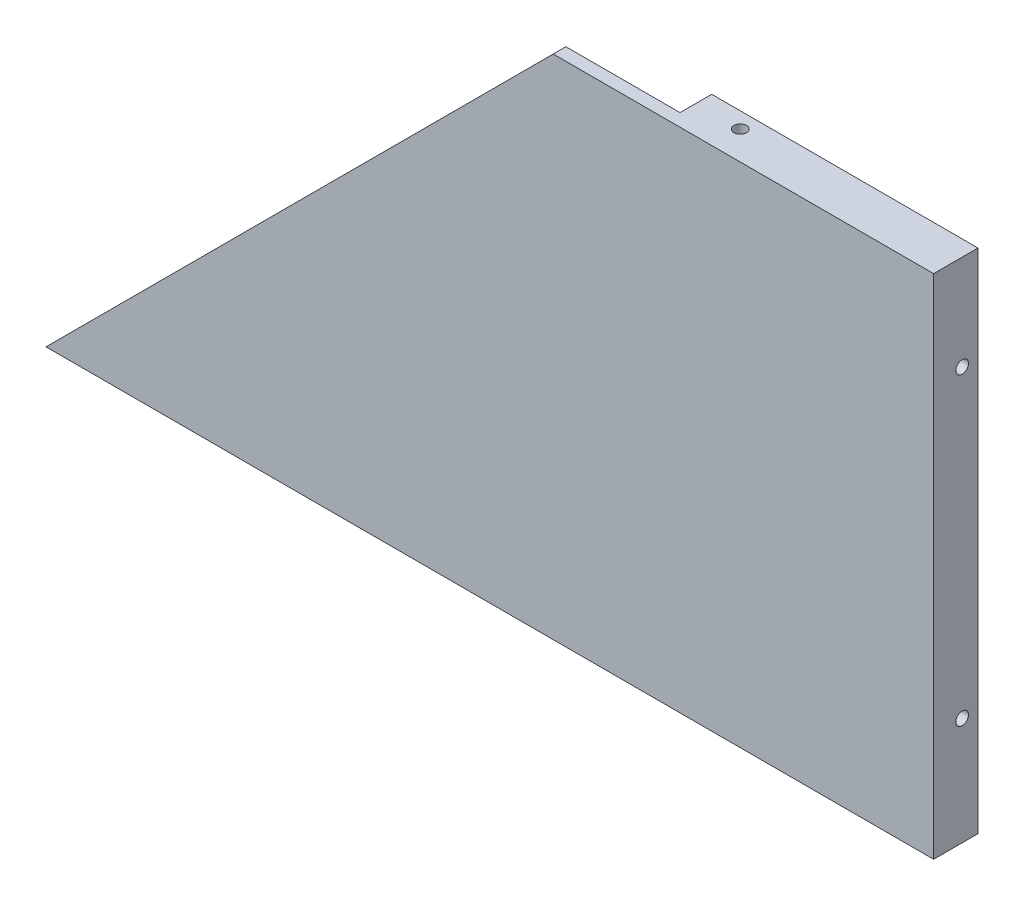
ISO-10303-21;
HEADER;
FILE_DESCRIPTION(('STEP AP214'),'2;1');
FILE_NAME('part.step','',(''),(''),'','','');
FILE_SCHEMA(('AUTOMOTIVE_DESIGN { 1 0 10303 214 1 1 1 1 }'));
ENDSEC;
DATA;
#1=APPLICATION_CONTEXT('core data for automotive mechanical design processes');
#2=APPLICATION_PROTOCOL_DEFINITION('international standard','automotive_design',2000,#1);
#3=PRODUCT_CONTEXT('',#1,'mechanical');
#4=PRODUCT('Part','Part','',(#3));
#5=PRODUCT_RELATED_PRODUCT_CATEGORY('part','',(#4));
#6=PRODUCT_DEFINITION_FORMATION('','',#4);
#7=PRODUCT_DEFINITION_CONTEXT('part definition',#1,'design');
#8=PRODUCT_DEFINITION('design','',#6,#7);
#9=PRODUCT_DEFINITION_SHAPE('','',#8);
#10=(LENGTH_UNIT() NAMED_UNIT(*) SI_UNIT(.MILLI.,.METRE.));
#11=(NAMED_UNIT(*) PLANE_ANGLE_UNIT() SI_UNIT($,.RADIAN.));
#12=(NAMED_UNIT(*) SI_UNIT($,.STERADIAN.) SOLID_ANGLE_UNIT());
#13=UNCERTAINTY_MEASURE_WITH_UNIT(LENGTH_MEASURE(1.E-05),#10,'distance_accuracy_value','');
#14=(GEOMETRIC_REPRESENTATION_CONTEXT(3) GLOBAL_UNCERTAINTY_ASSIGNED_CONTEXT((#13)) GLOBAL_UNIT_ASSIGNED_CONTEXT((#10,
#11,#12)) REPRESENTATION_CONTEXT('',''));
#15=CARTESIAN_POINT('',(0.,0.,0.));
#16=DIRECTION('',(0.,0.,1.));
#17=DIRECTION('',(1.,0.,0.));
#18=AXIS2_PLACEMENT_3D('',#15,#16,#17);
#19=CARTESIAN_POINT('',(0.,0.,0.));
#20=DIRECTION('',(0.,0.,-1.));
#21=DIRECTION('',(-1.,0.,0.));
#22=AXIS2_PLACEMENT_3D('',#19,#20,#21);
#23=PLANE('',#22);
#24=DIRECTION('',(-0.707106781186544,0.707106781186551,0.));
#25=VECTOR('',#24,1.);
#26=CARTESIAN_POINT('',(-248.887301627792,25.4558441227155,0.));
#27=LINE('',#26,#25);
#28=CARTESIAN_POINT('',(-248.887301627792,25.4558441227155,0.));
#29=VERTEX_POINT('',#28);
#30=CARTESIAN_POINT('',(-251.715728752538,28.2842712474618,0.));
#31=VERTEX_POINT('',#30);
#32=EDGE_CURVE('E161',#29,#31,#27,.T.);
#33=ORIENTED_EDGE('',*,*,#32,.F.);
#34=DIRECTION('',(0.707106781186551,0.707106781186544,0.));
#35=VECTOR('',#34,1.);
#36=CARTESIAN_POINT('',(-131.313708498983,143.029437251523,0.));
#37=LINE('',#36,#35);
#38=CARTESIAN_POINT('',(-131.313708498983,143.029437251523,0.));
#39=VERTEX_POINT('',#38);
#40=EDGE_CURVE('E154',#29,#39,#37,.T.);
#41=ORIENTED_EDGE('',*,*,#40,.T.);
#42=DIRECTION('',(-0.707106781186544,0.707106781186551,0.));
#43=VECTOR('',#42,1.);
#44=CARTESIAN_POINT('',(-131.313708498983,143.029437251523,0.));
#45=LINE('',#44,#43);
#46=CARTESIAN_POINT('',(-134.142135623729,145.857864376269,0.));
#47=VERTEX_POINT('',#46);
#48=EDGE_CURVE('E137',#39,#47,#45,.T.);
#49=ORIENTED_EDGE('',*,*,#48,.T.);
#50=DIRECTION('',(-0.707106781186551,-0.707106781186544,0.));
#51=VECTOR('',#50,1.);
#52=CARTESIAN_POINT('',(-280.,0.,0.));
#53=LINE('',#52,#51);
#54=CARTESIAN_POINT('',(-119.999999999998,160.,0.));
#55=VERTEX_POINT('',#54);
#56=EDGE_CURVE('E278',#55,#47,#53,.T.);
#57=ORIENTED_EDGE('',*,*,#56,.F.);
#58=DIRECTION('',(-1.,0.,0.));
#59=VECTOR('',#58,1.);
#60=CARTESIAN_POINT('',(-119.999999999998,160.,0.));
#61=LINE('',#60,#59);
#62=CARTESIAN_POINT('',(-84.,160.,0.));
#63=VERTEX_POINT('',#62);
#64=EDGE_CURVE('E260',#63,#55,#61,.T.);
#65=ORIENTED_EDGE('',*,*,#64,.F.);
#66=DIRECTION('',(0.,1.,0.));
#67=VECTOR('',#66,1.);
#68=CARTESIAN_POINT('',(-84.,156.,0.));
#69=LINE('',#68,#67);
#70=CARTESIAN_POINT('',(-84.,156.,0.));
#71=VERTEX_POINT('',#70);
#72=EDGE_CURVE('E197',#71,#63,#69,.T.);
#73=ORIENTED_EDGE('',*,*,#72,.F.);
#74=DIRECTION('',(1.,0.,0.));
#75=VECTOR('',#74,1.);
#76=CARTESIAN_POINT('',(-84.,156.,0.));
#77=LINE('',#76,#75);
#78=CARTESIAN_POINT('',(-4.,156.,0.));
#79=VERTEX_POINT('',#78);
#80=EDGE_CURVE('E188',#71,#79,#77,.T.);
#81=ORIENTED_EDGE('',*,*,#80,.T.);
#82=DIRECTION('',(0.,-1.,0.));
#83=VECTOR('',#82,1.);
#84=CARTESIAN_POINT('',(-4.,160.,0.));
#85=LINE('',#84,#83);
#86=CARTESIAN_POINT('',(-4.,4.,0.));
#87=VERTEX_POINT('',#86);
#88=EDGE_CURVE('E214',#79,#87,#85,.T.);
#89=ORIENTED_EDGE('',*,*,#88,.T.);
#90=DIRECTION('',(-1.,0.,0.));
#91=VECTOR('',#90,1.);
#92=CARTESIAN_POINT('',(-260.,4.,0.));
#93=LINE('',#92,#91);
#94=CARTESIAN_POINT('',(-260.,4.,0.));
#95=VERTEX_POINT('',#94);
#96=EDGE_CURVE('E252',#87,#95,#93,.T.);
#97=ORIENTED_EDGE('',*,*,#96,.T.);
#98=DIRECTION('',(0.,-1.,0.));
#99=VECTOR('',#98,1.);
#100=CARTESIAN_POINT('',(-260.,4.,0.));
#101=LINE('',#100,#99);
#102=CARTESIAN_POINT('',(-260.,0.,0.));
#103=VERTEX_POINT('',#102);
#104=EDGE_CURVE('E258',#95,#103,#101,.T.);
#105=ORIENTED_EDGE('',*,*,#104,.T.);
#106=DIRECTION('',(1.,0.,0.));
#107=VECTOR('',#106,1.);
#108=CARTESIAN_POINT('',(0.,0.,0.));
#109=LINE('',#108,#107);
#110=CARTESIAN_POINT('',(-280.,0.,0.));
#111=VERTEX_POINT('',#110);
#112=EDGE_CURVE('E269',#111,#103,#109,.T.);
#113=ORIENTED_EDGE('',*,*,#112,.F.);
#114=EDGE_CURVE('E277',#31,#111,#53,.T.);
#115=ORIENTED_EDGE('',*,*,#114,.F.);
#116=EDGE_LOOP('',(#33,#41,#49,#57,#65,#73,#81,#89,#97,#105,#113,#115));
#117=FACE_BOUND('',#116,.T.);
#118=ADVANCED_FACE('F35',(#117),#23,.T.);
#119=CARTESIAN_POINT('',(0.,4.,0.));
#120=DIRECTION('',(0.,-1.,0.));
#121=DIRECTION('',(0.,0.,-1.));
#122=AXIS2_PLACEMENT_3D('',#119,#120,#121);
#123=PLANE('',#122);
#124=CARTESIAN_POINT('',(-210.,4.,-5.));
#125=DIRECTION('',(0.,-1.,0.));
#126=DIRECTION('',(0.,0.,-1.));
#127=AXIS2_PLACEMENT_3D('',#124,#125,#126);
#128=CIRCLE('',#127,2.);
#129=CARTESIAN_POINT('',(-210.,4.,-7.));
#130=VERTEX_POINT('',#129);
#131=EDGE_CURVE('E240',#130,#130,#128,.T.);
#132=ORIENTED_EDGE('',*,*,#131,.T.);
#133=EDGE_LOOP('',(#132));
#134=FACE_BOUND('',#133,.T.);
#135=CARTESIAN_POINT('',(-140.,4.,-5.));
#136=DIRECTION('',(0.,-1.,0.));
#137=DIRECTION('',(0.,0.,-1.));
#138=AXIS2_PLACEMENT_3D('',#135,#136,#137);
#139=CIRCLE('',#138,2.);
#140=CARTESIAN_POINT('',(-140.,4.,-7.));
#141=VERTEX_POINT('',#140);
#142=EDGE_CURVE('E234',#141,#141,#139,.T.);
#143=ORIENTED_EDGE('',*,*,#142,.T.);
#144=EDGE_LOOP('',(#143));
#145=FACE_BOUND('',#144,.T.);
#146=CARTESIAN_POINT('',(-70.,4.,-5.));
#147=DIRECTION('',(0.,-1.,0.));
#148=DIRECTION('',(0.,0.,-1.));
#149=AXIS2_PLACEMENT_3D('',#146,#147,#148);
#150=CIRCLE('',#149,2.);
#151=CARTESIAN_POINT('',(-70.,4.,-7.));
#152=VERTEX_POINT('',#151);
#153=EDGE_CURVE('E228',#152,#152,#150,.T.);
#154=ORIENTED_EDGE('',*,*,#153,.T.);
#155=EDGE_LOOP('',(#154));
#156=FACE_BOUND('',#155,.T.);
#157=DIRECTION('',(0.,0.,-1.));
#158=VECTOR('',#157,1.);
#159=CARTESIAN_POINT('',(-4.,4.,0.));
#160=LINE('',#159,#158);
#161=CARTESIAN_POINT('',(-4.,4.,-10.));
#162=VERTEX_POINT('',#161);
#163=EDGE_CURVE('E218',#87,#162,#160,.T.);
#164=ORIENTED_EDGE('',*,*,#163,.T.);
#165=DIRECTION('',(1.,0.,0.));
#166=VECTOR('',#165,1.);
#167=CARTESIAN_POINT('',(-260.,4.,-10.));
#168=LINE('',#167,#166);
#169=CARTESIAN_POINT('',(-260.,4.,-10.));
#170=VERTEX_POINT('',#169);
#171=EDGE_CURVE('E248',#170,#162,#168,.T.);
#172=ORIENTED_EDGE('',*,*,#171,.F.);
#173=DIRECTION('',(0.,0.,-1.));
#174=VECTOR('',#173,1.);
#175=CARTESIAN_POINT('',(-260.,4.,0.));
#176=LINE('',#175,#174);
#177=EDGE_CURVE('E245',#95,#170,#176,.T.);
#178=ORIENTED_EDGE('',*,*,#177,.F.);
#179=ORIENTED_EDGE('',*,*,#96,.F.);
#180=EDGE_LOOP('',(#164,#172,#178,#179));
#181=FACE_BOUND('',#180,.T.);
#182=ADVANCED_FACE('F312',(#134,#145,#156,#181),#123,.F.);
#183=CARTESIAN_POINT('',(0.,160.,4.));
#184=DIRECTION('',(-1.,0.,0.));
#185=DIRECTION('',(0.,-1.,0.));
#186=AXIS2_PLACEMENT_3D('',#183,#184,#185);
#187=PLANE('',#186);
#188=DIRECTION('',(0.,-1.,0.));
#189=VECTOR('',#188,1.);
#190=CARTESIAN_POINT('',(0.,4.,-10.));
#191=LINE('',#190,#189);
#192=CARTESIAN_POINT('',(0.,160.,-9.99999999999998));
#193=VERTEX_POINT('',#192);
#194=CARTESIAN_POINT('',(0.,0.,-10.));
#195=VERTEX_POINT('',#194);
#196=EDGE_CURVE('E261',#193,#195,#191,.T.);
#197=ORIENTED_EDGE('',*,*,#196,.F.);
#198=DIRECTION('',(0.,0.,-1.));
#199=VECTOR('',#198,1.);
#200=CARTESIAN_POINT('',(0.,160.,4.));
#201=LINE('',#200,#199);
#202=CARTESIAN_POINT('',(0.,160.,4.));
#203=VERTEX_POINT('',#202);
#204=EDGE_CURVE('E11',#203,#193,#201,.T.);
#205=ORIENTED_EDGE('',*,*,#204,.F.);
#206=DIRECTION('',(0.,1.,0.));
#207=VECTOR('',#206,1.);
#208=CARTESIAN_POINT('',(0.,160.,4.));
#209=LINE('',#208,#207);
#210=CARTESIAN_POINT('',(0.,0.,4.));
#211=VERTEX_POINT('',#210);
#212=EDGE_CURVE('E265',#211,#203,#209,.T.);
#213=ORIENTED_EDGE('',*,*,#212,.F.);
#214=DIRECTION('',(0.,0.,-1.));
#215=VECTOR('',#214,1.);
#216=CARTESIAN_POINT('',(0.,0.,4.));
#217=LINE('',#216,#215);
#218=EDGE_CURVE('E275',#211,#195,#217,.T.);
#219=ORIENTED_EDGE('',*,*,#218,.T.);
#220=EDGE_LOOP('',(#197,#205,#213,#219));
#221=FACE_BOUND('',#220,.T.);
#222=CARTESIAN_POINT('',(0.,130.,-4.99999999999999));
#223=DIRECTION('',(1.,0.,0.));
#224=DIRECTION('',(0.,1.,0.));
#225=AXIS2_PLACEMENT_3D('',#222,#223,#224);
#226=CIRCLE('',#225,2.);
#227=CARTESIAN_POINT('',(0.,132.,-4.99999999999999));
#228=VERTEX_POINT('',#227);
#229=EDGE_CURVE('E203',#228,#228,#226,.T.);
#230=ORIENTED_EDGE('',*,*,#229,.F.);
#231=EDGE_LOOP('',(#230));
#232=FACE_BOUND('',#231,.T.);
#233=CARTESIAN_POINT('',(0.,34.,-5.));
#234=DIRECTION('',(1.,0.,0.));
#235=DIRECTION('',(0.,1.,0.));
#236=AXIS2_PLACEMENT_3D('',#233,#234,#235);
#237=CIRCLE('',#236,2.);
#238=CARTESIAN_POINT('',(0.,36.,-5.));
#239=VERTEX_POINT('',#238);
#240=EDGE_CURVE('E208',#239,#239,#237,.T.);
#241=ORIENTED_EDGE('',*,*,#240,.F.);
#242=EDGE_LOOP('',(#241));
#243=FACE_BOUND('',#242,.T.);
#244=ADVANCED_FACE('F37',(#221,#232,#243),#187,.F.);
#245=CARTESIAN_POINT('',(-119.999999999998,160.,4.));
#246=DIRECTION('',(0.,-1.,0.));
#247=DIRECTION('',(0.,0.,-1.));
#248=AXIS2_PLACEMENT_3D('',#245,#246,#247);
#249=PLANE('',#248);
#250=DIRECTION('',(0.,0.,1.));
#251=VECTOR('',#250,1.);
#252=CARTESIAN_POINT('',(-84.,160.,0.));
#253=LINE('',#252,#251);
#254=CARTESIAN_POINT('',(-84.,160.,-10.));
#255=VERTEX_POINT('',#254);
#256=EDGE_CURVE('E182',#255,#63,#253,.T.);
#257=ORIENTED_EDGE('',*,*,#256,.T.);
#258=ORIENTED_EDGE('',*,*,#64,.T.);
#259=DIRECTION('',(0.,0.,-1.));
#260=VECTOR('',#259,1.);
#261=CARTESIAN_POINT('',(-119.999999999998,160.,4.));
#262=LINE('',#261,#260);
#263=CARTESIAN_POINT('',(-119.999999999998,160.,4.));
#264=VERTEX_POINT('',#263);
#265=EDGE_CURVE('E43',#264,#55,#262,.T.);
#266=ORIENTED_EDGE('',*,*,#265,.F.);
#267=DIRECTION('',(-1.,0.,0.));
#268=VECTOR('',#267,1.);
#269=CARTESIAN_POINT('',(-119.999999999998,160.,4.));
#270=LINE('',#269,#268);
#271=EDGE_CURVE('E268',#203,#264,#270,.T.);
#272=ORIENTED_EDGE('',*,*,#271,.F.);
#273=ORIENTED_EDGE('',*,*,#204,.T.);
#274=DIRECTION('',(1.,0.,0.));
#275=VECTOR('',#274,1.);
#276=CARTESIAN_POINT('',(-4.,160.,-9.99999999999998));
#277=LINE('',#276,#275);
#278=EDGE_CURVE('E224',#255,#193,#277,.T.);
#279=ORIENTED_EDGE('',*,*,#278,.F.);
#280=EDGE_LOOP('',(#257,#258,#266,#272,#273,#279));
#281=FACE_BOUND('',#280,.T.);
#282=CARTESIAN_POINT('',(-70.,160.,-5.));
#283=DIRECTION('',(0.,1.,0.));
#284=DIRECTION('',(0.,0.,1.));
#285=AXIS2_PLACEMENT_3D('',#282,#283,#284);
#286=CIRCLE('',#285,2.);
#287=CARTESIAN_POINT('',(-70.,160.,-3.));
#288=VERTEX_POINT('',#287);
#289=EDGE_CURVE('E175',#288,#288,#286,.T.);
#290=ORIENTED_EDGE('',*,*,#289,.F.);
#291=EDGE_LOOP('',(#290));
#292=FACE_BOUND('',#291,.T.);
#293=ADVANCED_FACE('F294',(#281,#292),#249,.F.);
#294=CARTESIAN_POINT('',(-280.,0.,4.));
#295=DIRECTION('',(0.707106781186544,-0.707106781186551,0.));
#296=DIRECTION('',(0.707106781186551,0.707106781186544,0.));
#297=AXIS2_PLACEMENT_3D('',#294,#295,#296);
#298=PLANE('',#297);
#299=ORIENTED_EDGE('',*,*,#56,.T.);
#300=DIRECTION('',(0.,0.,-1.));
#301=VECTOR('',#300,1.);
#302=CARTESIAN_POINT('',(-134.142135623729,145.857864376269,0.));
#303=LINE('',#302,#301);
#304=CARTESIAN_POINT('',(-134.142135623729,145.857864376269,-10.));
#305=VERTEX_POINT('',#304);
#306=EDGE_CURVE('E142',#47,#305,#303,.T.);
#307=ORIENTED_EDGE('',*,*,#306,.T.);
#308=DIRECTION('',(-0.707106781186551,-0.707106781186544,0.));
#309=VECTOR('',#308,1.);
#310=CARTESIAN_POINT('',(-134.142135623729,145.857864376269,-10.));
#311=LINE('',#310,#309);
#312=CARTESIAN_POINT('',(-251.715728752538,28.2842712474617,-10.));
#313=VERTEX_POINT('',#312);
#314=EDGE_CURVE('E163',#305,#313,#311,.T.);
#315=ORIENTED_EDGE('',*,*,#314,.T.);
#316=DIRECTION('',(0.,0.,1.));
#317=VECTOR('',#316,1.);
#318=CARTESIAN_POINT('',(-251.715728752538,28.2842712474617,0.));
#319=LINE('',#318,#317);
#320=EDGE_CURVE('E50',#313,#31,#319,.T.);
#321=ORIENTED_EDGE('',*,*,#320,.T.);
#322=ORIENTED_EDGE('',*,*,#114,.T.);
#323=DIRECTION('',(0.,0.,-1.));
#324=VECTOR('',#323,1.);
#325=CARTESIAN_POINT('',(-280.,0.,4.));
#326=LINE('',#325,#324);
#327=CARTESIAN_POINT('',(-280.,0.,4.));
#328=VERTEX_POINT('',#327);
#329=EDGE_CURVE('E283',#328,#111,#326,.T.);
#330=ORIENTED_EDGE('',*,*,#329,.F.);
#331=DIRECTION('',(-0.707106781186551,-0.707106781186544,0.));
#332=VECTOR('',#331,1.);
#333=CARTESIAN_POINT('',(-280.,0.,4.));
#334=LINE('',#333,#332);
#335=EDGE_CURVE('E271',#264,#328,#334,.T.);
#336=ORIENTED_EDGE('',*,*,#335,.F.);
#337=ORIENTED_EDGE('',*,*,#265,.T.);
#338=EDGE_LOOP('',(#299,#307,#315,#321,#322,#330,#336,#337));
#339=FACE_BOUND('',#338,.T.);
#340=CARTESIAN_POINT('',(-237.573593128807,42.4264068711926,-5.));
#341=DIRECTION('',(-0.707106781186544,0.707106781186551,0.));
#342=DIRECTION('',(-0.707106781186551,-0.707106781186544,0.));
#343=AXIS2_PLACEMENT_3D('',#340,#341,#342);
#344=CIRCLE('',#343,2.);
#345=CARTESIAN_POINT('',(-238.98780669118,41.0121933088195,-5.));
#346=VERTEX_POINT('',#345);
#347=EDGE_CURVE('E566',#346,#346,#344,.T.);
#348=ORIENTED_EDGE('',*,*,#347,.F.);
#349=EDGE_LOOP('',(#348));
#350=FACE_BOUND('',#349,.T.);
#351=CARTESIAN_POINT('',(-148.28427124746,131.715728752538,-5.));
#352=DIRECTION('',(-0.707106781186544,0.707106781186551,0.));
#353=DIRECTION('',(-0.707106781186551,-0.707106781186544,0.));
#354=AXIS2_PLACEMENT_3D('',#351,#352,#353);
#355=CIRCLE('',#354,2.);
#356=CARTESIAN_POINT('',(-149.698484809833,130.301515190165,-5.));
#357=VERTEX_POINT('',#356);
#358=EDGE_CURVE('E166',#357,#357,#355,.T.);
#359=ORIENTED_EDGE('',*,*,#358,.F.);
#360=EDGE_LOOP('',(#359));
#361=FACE_BOUND('',#360,.T.);
#362=ADVANCED_FACE('F288',(#339,#350,#361),#298,.F.);
#363=CARTESIAN_POINT('',(0.,0.,4.));
#364=DIRECTION('',(0.,1.,0.));
#365=DIRECTION('',(-1.,0.,0.));
#366=AXIS2_PLACEMENT_3D('',#363,#364,#365);
#367=PLANE('',#366);
#368=ORIENTED_EDGE('',*,*,#112,.T.);
#369=DIRECTION('',(0.,0.,-1.));
#370=VECTOR('',#369,1.);
#371=CARTESIAN_POINT('',(-260.,0.,0.));
#372=LINE('',#371,#370);
#373=CARTESIAN_POINT('',(-260.,0.,-10.));
#374=VERTEX_POINT('',#373);
#375=EDGE_CURVE('E58',#103,#374,#372,.T.);
#376=ORIENTED_EDGE('',*,*,#375,.T.);
#377=DIRECTION('',(1.,0.,0.));
#378=VECTOR('',#377,1.);
#379=CARTESIAN_POINT('',(-260.,0.,-10.));
#380=LINE('',#379,#378);
#381=EDGE_CURVE('E249',#374,#195,#380,.T.);
#382=ORIENTED_EDGE('',*,*,#381,.T.);
#383=ORIENTED_EDGE('',*,*,#218,.F.);
#384=DIRECTION('',(1.,0.,0.));
#385=VECTOR('',#384,1.);
#386=CARTESIAN_POINT('',(0.,0.,4.));
#387=LINE('',#386,#385);
#388=EDGE_CURVE('E273',#328,#211,#387,.T.);
#389=ORIENTED_EDGE('',*,*,#388,.F.);
#390=ORIENTED_EDGE('',*,*,#329,.T.);
#391=EDGE_LOOP('',(#368,#376,#382,#383,#389,#390));
#392=FACE_BOUND('',#391,.T.);
#393=CARTESIAN_POINT('',(-70.,0.,-5.));
#394=DIRECTION('',(0.,-1.,0.));
#395=DIRECTION('',(0.,0.,-1.));
#396=AXIS2_PLACEMENT_3D('',#393,#394,#395);
#397=CIRCLE('',#396,2.);
#398=CARTESIAN_POINT('',(-70.,0.,-7.));
#399=VERTEX_POINT('',#398);
#400=EDGE_CURVE('E227',#399,#399,#397,.T.);
#401=ORIENTED_EDGE('',*,*,#400,.F.);
#402=EDGE_LOOP('',(#401));
#403=FACE_BOUND('',#402,.T.);
#404=CARTESIAN_POINT('',(-140.,0.,-5.));
#405=DIRECTION('',(0.,-1.,0.));
#406=DIRECTION('',(0.,0.,-1.));
#407=AXIS2_PLACEMENT_3D('',#404,#405,#406);
#408=CIRCLE('',#407,2.);
#409=CARTESIAN_POINT('',(-140.,0.,-7.));
#410=VERTEX_POINT('',#409);
#411=EDGE_CURVE('E231',#410,#410,#408,.T.);
#412=ORIENTED_EDGE('',*,*,#411,.F.);
#413=EDGE_LOOP('',(#412));
#414=FACE_BOUND('',#413,.T.);
#415=CARTESIAN_POINT('',(-210.,0.,-5.));
#416=DIRECTION('',(0.,-1.,0.));
#417=DIRECTION('',(0.,0.,-1.));
#418=AXIS2_PLACEMENT_3D('',#415,#416,#417);
#419=CIRCLE('',#418,2.);
#420=CARTESIAN_POINT('',(-210.,0.,-7.));
#421=VERTEX_POINT('',#420);
#422=EDGE_CURVE('E237',#421,#421,#419,.T.);
#423=ORIENTED_EDGE('',*,*,#422,.F.);
#424=EDGE_LOOP('',(#423));
#425=FACE_BOUND('',#424,.T.);
#426=ADVANCED_FACE('F319',(#392,#403,#414,#425),#367,.F.);
#427=CARTESIAN_POINT('',(0.,0.,4.));
#428=DIRECTION('',(0.,0.,-1.));
#429=DIRECTION('',(-1.,0.,0.));
#430=AXIS2_PLACEMENT_3D('',#427,#428,#429);
#431=PLANE('',#430);
#432=ORIENTED_EDGE('',*,*,#212,.T.);
#433=ORIENTED_EDGE('',*,*,#271,.T.);
#434=ORIENTED_EDGE('',*,*,#335,.T.);
#435=ORIENTED_EDGE('',*,*,#388,.T.);
#436=EDGE_LOOP('',(#432,#433,#434,#435));
#437=FACE_BOUND('',#436,.T.);
#438=ADVANCED_FACE('F324',(#437),#431,.F.);
#439=CARTESIAN_POINT('',(-260.,4.,0.));
#440=DIRECTION('',(-1.,0.,0.));
#441=DIRECTION('',(0.,0.,1.));
#442=AXIS2_PLACEMENT_3D('',#439,#440,#441);
#443=PLANE('',#442);
#444=ORIENTED_EDGE('',*,*,#375,.F.);
#445=ORIENTED_EDGE('',*,*,#104,.F.);
#446=ORIENTED_EDGE('',*,*,#177,.T.);
#447=DIRECTION('',(0.,-1.,0.));
#448=VECTOR('',#447,1.);
#449=CARTESIAN_POINT('',(-260.,4.,-10.));
#450=LINE('',#449,#448);
#451=EDGE_CURVE('E254',#170,#374,#450,.T.);
#452=ORIENTED_EDGE('',*,*,#451,.T.);
#453=EDGE_LOOP('',(#444,#445,#446,#452));
#454=FACE_BOUND('',#453,.T.);
#455=ADVANCED_FACE('F315',(#454),#443,.T.);
#456=CARTESIAN_POINT('',(-260.,4.,-10.));
#457=DIRECTION('',(0.,0.,-1.));
#458=DIRECTION('',(-1.,0.,0.));
#459=AXIS2_PLACEMENT_3D('',#456,#457,#458);
#460=PLANE('',#459);
#461=ORIENTED_EDGE('',*,*,#381,.F.);
#462=ORIENTED_EDGE('',*,*,#451,.F.);
#463=ORIENTED_EDGE('',*,*,#171,.T.);
#464=DIRECTION('',(0.,1.,0.));
#465=VECTOR('',#464,1.);
#466=CARTESIAN_POINT('',(-4.,160.,-9.99999999999998));
#467=LINE('',#466,#465);
#468=CARTESIAN_POINT('',(-4.,156.,-10.));
#469=VERTEX_POINT('',#468);
#470=EDGE_CURVE('E221',#162,#469,#467,.T.);
#471=ORIENTED_EDGE('',*,*,#470,.T.);
#472=DIRECTION('',(-1.,0.,0.));
#473=VECTOR('',#472,1.);
#474=CARTESIAN_POINT('',(-84.,156.,-10.));
#475=LINE('',#474,#473);
#476=CARTESIAN_POINT('',(-84.,156.,-10.));
#477=VERTEX_POINT('',#476);
#478=EDGE_CURVE('E194',#469,#477,#475,.T.);
#479=ORIENTED_EDGE('',*,*,#478,.T.);
#480=DIRECTION('',(0.,1.,0.));
#481=VECTOR('',#480,1.);
#482=CARTESIAN_POINT('',(-84.,156.,-10.));
#483=LINE('',#482,#481);
#484=EDGE_CURVE('E200',#477,#255,#483,.T.);
#485=ORIENTED_EDGE('',*,*,#484,.T.);
#486=ORIENTED_EDGE('',*,*,#278,.T.);
#487=ORIENTED_EDGE('',*,*,#196,.T.);
#488=EDGE_LOOP('',(#461,#462,#463,#471,#479,#485,#486,#487));
#489=FACE_BOUND('',#488,.T.);
#490=ADVANCED_FACE('F304',(#489),#460,.T.);
#491=CARTESIAN_POINT('',(-210.,4.,-5.));
#492=DIRECTION('',(0.,-1.,0.));
#493=DIRECTION('',(0.,0.,-1.));
#494=AXIS2_PLACEMENT_3D('',#491,#492,#493);
#495=CYLINDRICAL_SURFACE('',#494,2.);
#496=ORIENTED_EDGE('',*,*,#131,.F.);
#497=EDGE_LOOP('',(#496));
#498=FACE_BOUND('',#497,.T.);
#499=ORIENTED_EDGE('',*,*,#422,.T.);
#500=EDGE_LOOP('',(#499));
#501=FACE_BOUND('',#500,.T.);
#502=ADVANCED_FACE('F393',(#498,#501),#495,.F.);
#503=CARTESIAN_POINT('',(-140.,4.,-5.));
#504=DIRECTION('',(0.,-1.,0.));
#505=DIRECTION('',(0.,0.,-1.));
#506=AXIS2_PLACEMENT_3D('',#503,#504,#505);
#507=CYLINDRICAL_SURFACE('',#506,2.);
#508=ORIENTED_EDGE('',*,*,#142,.F.);
#509=EDGE_LOOP('',(#508));
#510=FACE_BOUND('',#509,.T.);
#511=ORIENTED_EDGE('',*,*,#411,.T.);
#512=EDGE_LOOP('',(#511));
#513=FACE_BOUND('',#512,.T.);
#514=ADVANCED_FACE('F400',(#510,#513),#507,.F.);
#515=CARTESIAN_POINT('',(-70.,4.,-5.));
#516=DIRECTION('',(0.,-1.,0.));
#517=DIRECTION('',(0.,0.,-1.));
#518=AXIS2_PLACEMENT_3D('',#515,#516,#517);
#519=CYLINDRICAL_SURFACE('',#518,2.);
#520=ORIENTED_EDGE('',*,*,#153,.F.);
#521=EDGE_LOOP('',(#520));
#522=FACE_BOUND('',#521,.T.);
#523=ORIENTED_EDGE('',*,*,#400,.T.);
#524=EDGE_LOOP('',(#523));
#525=FACE_BOUND('',#524,.T.);
#526=ADVANCED_FACE('F344',(#522,#525),#519,.F.);
#527=CARTESIAN_POINT('',(-4.,0.,0.));
#528=DIRECTION('',(1.,0.,0.));
#529=DIRECTION('',(0.,1.,0.));
#530=AXIS2_PLACEMENT_3D('',#527,#528,#529);
#531=PLANE('',#530);
#532=CARTESIAN_POINT('',(-4.,130.,-4.99999999999999));
#533=DIRECTION('',(1.,0.,0.));
#534=DIRECTION('',(0.,1.,0.));
#535=AXIS2_PLACEMENT_3D('',#532,#533,#534);
#536=CIRCLE('',#535,2.);
#537=CARTESIAN_POINT('',(-4.,132.,-4.99999999999999));
#538=VERTEX_POINT('',#537);
#539=EDGE_CURVE('E205',#538,#538,#536,.T.);
#540=ORIENTED_EDGE('',*,*,#539,.T.);
#541=EDGE_LOOP('',(#540));
#542=FACE_BOUND('',#541,.T.);
#543=CARTESIAN_POINT('',(-4.,34.,-5.));
#544=DIRECTION('',(1.,0.,0.));
#545=DIRECTION('',(0.,1.,0.));
#546=AXIS2_PLACEMENT_3D('',#543,#544,#545);
#547=CIRCLE('',#546,2.);
#548=CARTESIAN_POINT('',(-4.,36.,-5.));
#549=VERTEX_POINT('',#548);
#550=EDGE_CURVE('E211',#549,#549,#547,.T.);
#551=ORIENTED_EDGE('',*,*,#550,.T.);
#552=EDGE_LOOP('',(#551));
#553=FACE_BOUND('',#552,.T.);
#554=ORIENTED_EDGE('',*,*,#88,.F.);
#555=DIRECTION('',(0.,0.,-1.));
#556=VECTOR('',#555,1.);
#557=CARTESIAN_POINT('',(-4.,156.,0.));
#558=LINE('',#557,#556);
#559=EDGE_CURVE('E191',#79,#469,#558,.T.);
#560=ORIENTED_EDGE('',*,*,#559,.T.);
#561=ORIENTED_EDGE('',*,*,#470,.F.);
#562=ORIENTED_EDGE('',*,*,#163,.F.);
#563=EDGE_LOOP('',(#554,#560,#561,#562));
#564=FACE_BOUND('',#563,.T.);
#565=ADVANCED_FACE('F309',(#542,#553,#564),#531,.F.);
#566=CARTESIAN_POINT('',(-4.,34.,-5.));
#567=DIRECTION('',(1.,0.,0.));
#568=DIRECTION('',(0.,1.,0.));
#569=AXIS2_PLACEMENT_3D('',#566,#567,#568);
#570=CYLINDRICAL_SURFACE('',#569,2.);
#571=ORIENTED_EDGE('',*,*,#550,.F.);
#572=EDGE_LOOP('',(#571));
#573=FACE_BOUND('',#572,.T.);
#574=ORIENTED_EDGE('',*,*,#240,.T.);
#575=EDGE_LOOP('',(#574));
#576=FACE_BOUND('',#575,.T.);
#577=ADVANCED_FACE('F333',(#573,#576),#570,.F.);
#578=CARTESIAN_POINT('',(-4.,130.,-4.99999999999999));
#579=DIRECTION('',(1.,0.,0.));
#580=DIRECTION('',(0.,1.,0.));
#581=AXIS2_PLACEMENT_3D('',#578,#579,#580);
#582=CYLINDRICAL_SURFACE('',#581,2.);
#583=ORIENTED_EDGE('',*,*,#539,.F.);
#584=EDGE_LOOP('',(#583));
#585=FACE_BOUND('',#584,.T.);
#586=ORIENTED_EDGE('',*,*,#229,.T.);
#587=EDGE_LOOP('',(#586));
#588=FACE_BOUND('',#587,.T.);
#589=ADVANCED_FACE('F335',(#585,#588),#582,.F.);
#590=CARTESIAN_POINT('',(-84.,156.,0.));
#591=DIRECTION('',(-1.,0.,0.));
#592=DIRECTION('',(0.,0.,1.));
#593=AXIS2_PLACEMENT_3D('',#590,#591,#592);
#594=PLANE('',#593);
#595=ORIENTED_EDGE('',*,*,#256,.F.);
#596=ORIENTED_EDGE('',*,*,#484,.F.);
#597=DIRECTION('',(0.,0.,1.));
#598=VECTOR('',#597,1.);
#599=CARTESIAN_POINT('',(-84.,156.,0.));
#600=LINE('',#599,#598);
#601=EDGE_CURVE('E185',#477,#71,#600,.T.);
#602=ORIENTED_EDGE('',*,*,#601,.T.);
#603=ORIENTED_EDGE('',*,*,#72,.T.);
#604=EDGE_LOOP('',(#595,#596,#602,#603));
#605=FACE_BOUND('',#604,.T.);
#606=ADVANCED_FACE('F298',(#605),#594,.T.);
#607=CARTESIAN_POINT('',(0.,156.,0.));
#608=DIRECTION('',(0.,-1.,0.));
#609=DIRECTION('',(0.,0.,-1.));
#610=AXIS2_PLACEMENT_3D('',#607,#608,#609);
#611=PLANE('',#610);
#612=CARTESIAN_POINT('',(-70.,156.,-5.));
#613=DIRECTION('',(0.,1.,0.));
#614=DIRECTION('',(0.,0.,1.));
#615=AXIS2_PLACEMENT_3D('',#612,#613,#614);
#616=CIRCLE('',#615,2.);
#617=CARTESIAN_POINT('',(-70.,156.,-3.));
#618=VERTEX_POINT('',#617);
#619=EDGE_CURVE('E179',#618,#618,#616,.T.);
#620=ORIENTED_EDGE('',*,*,#619,.T.);
#621=EDGE_LOOP('',(#620));
#622=FACE_BOUND('',#621,.T.);
#623=ORIENTED_EDGE('',*,*,#601,.F.);
#624=ORIENTED_EDGE('',*,*,#478,.F.);
#625=ORIENTED_EDGE('',*,*,#559,.F.);
#626=ORIENTED_EDGE('',*,*,#80,.F.);
#627=EDGE_LOOP('',(#623,#624,#625,#626));
#628=FACE_BOUND('',#627,.T.);
#629=ADVANCED_FACE('F301',(#622,#628),#611,.T.);
#630=CARTESIAN_POINT('',(-70.,156.,-5.));
#631=DIRECTION('',(0.,1.,0.));
#632=DIRECTION('',(0.,0.,1.));
#633=AXIS2_PLACEMENT_3D('',#630,#631,#632);
#634=CYLINDRICAL_SURFACE('',#633,2.);
#635=ORIENTED_EDGE('',*,*,#619,.F.);
#636=EDGE_LOOP('',(#635));
#637=FACE_BOUND('',#636,.T.);
#638=ORIENTED_EDGE('',*,*,#289,.T.);
#639=EDGE_LOOP('',(#638));
#640=FACE_BOUND('',#639,.T.);
#641=ADVANCED_FACE('F439',(#637,#640),#634,.F.);
#642=CARTESIAN_POINT('',(-248.887301627792,25.4558441227155,0.));
#643=DIRECTION('',(-0.707106781186551,-0.707106781186544,0.));
#644=DIRECTION('',(0.707106781186544,-0.707106781186551,0.));
#645=AXIS2_PLACEMENT_3D('',#642,#643,#644);
#646=PLANE('',#645);
#647=ORIENTED_EDGE('',*,*,#320,.F.);
#648=DIRECTION('',(-0.707106781186544,0.707106781186551,0.));
#649=VECTOR('',#648,1.);
#650=CARTESIAN_POINT('',(-248.887301627792,25.4558441227155,-10.));
#651=LINE('',#650,#649);
#652=CARTESIAN_POINT('',(-248.887301627792,25.4558441227155,-10.));
#653=VERTEX_POINT('',#652);
#654=EDGE_CURVE('E176',#653,#313,#651,.T.);
#655=ORIENTED_EDGE('',*,*,#654,.F.);
#656=DIRECTION('',(0.,0.,1.));
#657=VECTOR('',#656,1.);
#658=CARTESIAN_POINT('',(-248.887301627792,25.4558441227155,0.));
#659=LINE('',#658,#657);
#660=EDGE_CURVE('E148',#653,#29,#659,.T.);
#661=ORIENTED_EDGE('',*,*,#660,.T.);
#662=ORIENTED_EDGE('',*,*,#32,.T.);
#663=EDGE_LOOP('',(#647,#655,#661,#662));
#664=FACE_BOUND('',#663,.T.);
#665=ADVANCED_FACE('F448',(#664),#646,.T.);
#666=CARTESIAN_POINT('',(-131.313708498983,143.029437251523,-10.));
#667=DIRECTION('',(0.,0.,-1.));
#668=DIRECTION('',(-1.,0.,0.));
#669=AXIS2_PLACEMENT_3D('',#666,#667,#668);
#670=PLANE('',#669);
#671=ORIENTED_EDGE('',*,*,#314,.F.);
#672=DIRECTION('',(-0.707106781186544,0.707106781186551,0.));
#673=VECTOR('',#672,1.);
#674=CARTESIAN_POINT('',(-131.313708498983,143.029437251523,-10.));
#675=LINE('',#674,#673);
#676=CARTESIAN_POINT('',(-131.313708498983,143.029437251523,-10.));
#677=VERTEX_POINT('',#676);
#678=EDGE_CURVE('E147',#677,#305,#675,.T.);
#679=ORIENTED_EDGE('',*,*,#678,.F.);
#680=DIRECTION('',(-0.707106781186551,-0.707106781186544,0.));
#681=VECTOR('',#680,1.);
#682=CARTESIAN_POINT('',(-131.313708498983,143.029437251523,-10.));
#683=LINE('',#682,#681);
#684=EDGE_CURVE('E157',#677,#653,#683,.T.);
#685=ORIENTED_EDGE('',*,*,#684,.T.);
#686=ORIENTED_EDGE('',*,*,#654,.T.);
#687=EDGE_LOOP('',(#671,#679,#685,#686));
#688=FACE_BOUND('',#687,.T.);
#689=ADVANCED_FACE('F510',(#688),#670,.T.);
#690=CARTESIAN_POINT('',(-131.313708498983,143.029437251523,0.));
#691=DIRECTION('',(0.707106781186551,0.707106781186544,0.));
#692=DIRECTION('',(-0.707106781186544,0.707106781186551,0.));
#693=AXIS2_PLACEMENT_3D('',#690,#691,#692);
#694=PLANE('',#693);
#695=ORIENTED_EDGE('',*,*,#306,.F.);
#696=ORIENTED_EDGE('',*,*,#48,.F.);
#697=DIRECTION('',(0.,0.,-1.));
#698=VECTOR('',#697,1.);
#699=CARTESIAN_POINT('',(-131.313708498983,143.029437251523,0.));
#700=LINE('',#699,#698);
#701=EDGE_CURVE('E140',#39,#677,#700,.T.);
#702=ORIENTED_EDGE('',*,*,#701,.T.);
#703=ORIENTED_EDGE('',*,*,#678,.T.);
#704=EDGE_LOOP('',(#695,#696,#702,#703));
#705=FACE_BOUND('',#704,.T.);
#706=ADVANCED_FACE('F139',(#705),#694,.T.);
#707=CARTESIAN_POINT('',(-137.171572875252,137.171572875254,0.));
#708=DIRECTION('',(0.707106781186544,-0.707106781186551,0.));
#709=DIRECTION('',(0.707106781186551,0.707106781186544,0.));
#710=AXIS2_PLACEMENT_3D('',#707,#708,#709);
#711=PLANE('',#710);
#712=CARTESIAN_POINT('',(-234.745166004061,39.5979797464464,-5.));
#713=DIRECTION('',(-0.707106781186544,0.707106781186551,0.));
#714=DIRECTION('',(-0.707106781186551,-0.707106781186544,0.));
#715=AXIS2_PLACEMENT_3D('',#712,#713,#714);
#716=CIRCLE('',#715,2.);
#717=CARTESIAN_POINT('',(-236.159379566434,38.1837661840733,-5.));
#718=VERTEX_POINT('',#717);
#719=EDGE_CURVE('E563',#718,#718,#716,.T.);
#720=ORIENTED_EDGE('',*,*,#719,.T.);
#721=EDGE_LOOP('',(#720));
#722=FACE_BOUND('',#721,.T.);
#723=CARTESIAN_POINT('',(-145.455844122714,128.887301627792,-5.));
#724=DIRECTION('',(-0.707106781186544,0.707106781186551,0.));
#725=DIRECTION('',(-0.707106781186551,-0.707106781186544,0.));
#726=AXIS2_PLACEMENT_3D('',#723,#724,#725);
#727=CIRCLE('',#726,2.);
#728=CARTESIAN_POINT('',(-146.870057685087,127.473088065419,-5.));
#729=VERTEX_POINT('',#728);
#730=EDGE_CURVE('E172',#729,#729,#727,.T.);
#731=ORIENTED_EDGE('',*,*,#730,.T.);
#732=EDGE_LOOP('',(#731));
#733=FACE_BOUND('',#732,.T.);
#734=ORIENTED_EDGE('',*,*,#40,.F.);
#735=ORIENTED_EDGE('',*,*,#660,.F.);
#736=ORIENTED_EDGE('',*,*,#684,.F.);
#737=ORIENTED_EDGE('',*,*,#701,.F.);
#738=EDGE_LOOP('',(#734,#735,#736,#737));
#739=FACE_BOUND('',#738,.T.);
#740=ADVANCED_FACE('F152',(#722,#733,#739),#711,.T.);
#741=CARTESIAN_POINT('',(-145.455844122714,128.887301627792,-5.));
#742=DIRECTION('',(-0.707106781186544,0.707106781186551,0.));
#743=DIRECTION('',(-0.707106781186551,-0.707106781186544,0.));
#744=AXIS2_PLACEMENT_3D('',#741,#742,#743);
#745=CYLINDRICAL_SURFACE('',#744,2.);
#746=ORIENTED_EDGE('',*,*,#730,.F.);
#747=EDGE_LOOP('',(#746));
#748=FACE_BOUND('',#747,.T.);
#749=ORIENTED_EDGE('',*,*,#358,.T.);
#750=EDGE_LOOP('',(#749));
#751=FACE_BOUND('',#750,.T.);
#752=ADVANCED_FACE('F534',(#748,#751),#745,.F.);
#753=CARTESIAN_POINT('',(-234.745166004061,39.5979797464464,-5.));
#754=DIRECTION('',(-0.707106781186544,0.707106781186551,0.));
#755=DIRECTION('',(-0.707106781186551,-0.707106781186544,0.));
#756=AXIS2_PLACEMENT_3D('',#753,#754,#755);
#757=CYLINDRICAL_SURFACE('',#756,2.);
#758=ORIENTED_EDGE('',*,*,#719,.F.);
#759=EDGE_LOOP('',(#758));
#760=FACE_BOUND('',#759,.T.);
#761=ORIENTED_EDGE('',*,*,#347,.T.);
#762=EDGE_LOOP('',(#761));
#763=FACE_BOUND('',#762,.T.);
#764=ADVANCED_FACE('F543',(#760,#763),#757,.F.);
#765=CLOSED_SHELL('',(#118,#182,#244,#293,#362,#426,#438,#455,#490,#502,#514,#526,#565,#577,
#589,#606,#629,#641,#665,#689,#706,#740,#752,#764));
#766=MANIFOLD_SOLID_BREP('B2',#765);
#767=ADVANCED_BREP_SHAPE_REPRESENTATION('',(#18,#766),#14);
#768=SHAPE_DEFINITION_REPRESENTATION(#9,#767);
ENDSEC;
END-ISO-10303-21;
